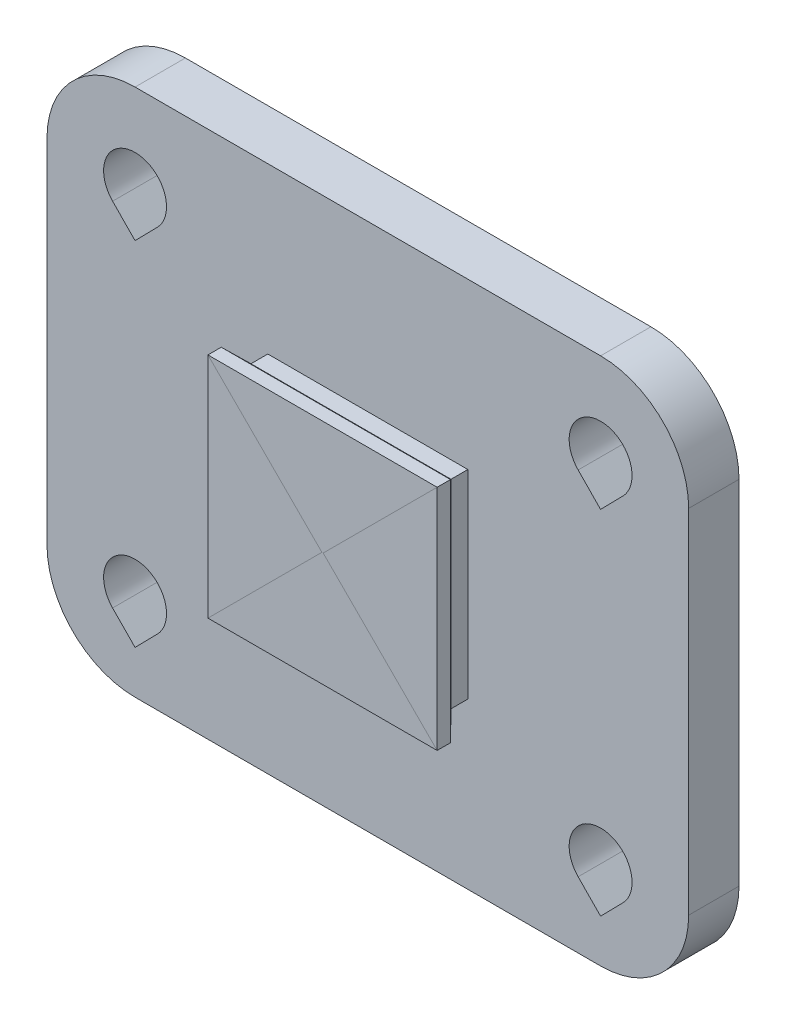
ISO-10303-21;
HEADER;
FILE_DESCRIPTION(('STEP AP214'),'2;1');
FILE_NAME('part.step','',(''),(''),'','','');
FILE_SCHEMA(('AUTOMOTIVE_DESIGN { 1 0 10303 214 1 1 1 1 }'));
ENDSEC;
DATA;
#1=APPLICATION_CONTEXT('core data for automotive mechanical design processes');
#2=APPLICATION_PROTOCOL_DEFINITION('international standard','automotive_design',2000,#1);
#3=PRODUCT_CONTEXT('',#1,'mechanical');
#4=PRODUCT('Part','Part','',(#3));
#5=PRODUCT_RELATED_PRODUCT_CATEGORY('part','',(#4));
#6=PRODUCT_DEFINITION_FORMATION('','',#4);
#7=PRODUCT_DEFINITION_CONTEXT('part definition',#1,'design');
#8=PRODUCT_DEFINITION('design','',#6,#7);
#9=PRODUCT_DEFINITION_SHAPE('','',#8);
#10=(LENGTH_UNIT() NAMED_UNIT(*) SI_UNIT(.MILLI.,.METRE.));
#11=(NAMED_UNIT(*) PLANE_ANGLE_UNIT() SI_UNIT($,.RADIAN.));
#12=(NAMED_UNIT(*) SI_UNIT($,.STERADIAN.) SOLID_ANGLE_UNIT());
#13=UNCERTAINTY_MEASURE_WITH_UNIT(LENGTH_MEASURE(1.E-05),#10,'distance_accuracy_value','');
#14=(GEOMETRIC_REPRESENTATION_CONTEXT(3) GLOBAL_UNCERTAINTY_ASSIGNED_CONTEXT((#13)) GLOBAL_UNIT_ASSIGNED_CONTEXT((#10,
#11,#12)) REPRESENTATION_CONTEXT('',''));
#15=CARTESIAN_POINT('',(0.,0.,0.));
#16=DIRECTION('',(0.,0.,1.));
#17=DIRECTION('',(1.,0.,0.));
#18=AXIS2_PLACEMENT_3D('',#15,#16,#17);
#19=CARTESIAN_POINT('',(18.5,10.4268529516415,8.0110740476336));
#20=DIRECTION('',(0.714472679632805,-0.699663340513364,0.));
#21=DIRECTION('',(0.,0.,-1.));
#22=AXIS2_PLACEMENT_3D('',#19,#20,#21);
#23=PLANE('',#22);
#24=DIRECTION('',(0.,0.,-1.));
#25=VECTOR('',#24,1.);
#26=CARTESIAN_POINT('',(18.5,10.4268529516415,4.));
#27=LINE('',#26,#25);
#28=CARTESIAN_POINT('',(18.5,10.4268529516415,4.));
#29=VERTEX_POINT('',#28);
#30=CARTESIAN_POINT('',(18.5,10.4268529516415,0.));
#31=VERTEX_POINT('',#30);
#32=EDGE_CURVE('E11',#29,#31,#27,.T.);
#33=ORIENTED_EDGE('',*,*,#32,.F.);
#34=DIRECTION('',(0.699663340513364,0.714472679632805,0.));
#35=VECTOR('',#34,1.);
#36=CARTESIAN_POINT('',(18.5,10.4268529516415,4.));
#37=LINE('',#36,#35);
#38=CARTESIAN_POINT('',(20.286181699082,12.2508416487166,4.));
#39=VERTEX_POINT('',#38);
#40=EDGE_CURVE('E364',#29,#39,#37,.T.);
#41=ORIENTED_EDGE('',*,*,#40,.T.);
#42=DIRECTION('',(0.,0.,-1.));
#43=VECTOR('',#42,1.);
#44=CARTESIAN_POINT('',(20.286181699082,12.2508416487166,4.));
#45=LINE('',#44,#43);
#46=CARTESIAN_POINT('',(20.286181699082,12.2508416487166,0.));
#47=VERTEX_POINT('',#46);
#48=EDGE_CURVE('E522',#39,#47,#45,.T.);
#49=ORIENTED_EDGE('',*,*,#48,.T.);
#50=DIRECTION('',(0.699663340513364,0.714472679632805,0.));
#51=VECTOR('',#50,1.);
#52=CARTESIAN_POINT('',(18.5,10.4268529516415,0.));
#53=LINE('',#52,#51);
#54=EDGE_CURVE('E439',#31,#47,#53,.T.);
#55=ORIENTED_EDGE('',*,*,#54,.F.);
#56=EDGE_LOOP('',(#33,#41,#49,#55));
#57=FACE_BOUND('',#56,.T.);
#58=ADVANCED_FACE('F17',(#57),#23,.F.);
#59=CARTESIAN_POINT('',(16.713818300918,12.2508416487166,8.0110740476336));
#60=DIRECTION('',(-0.714472679632804,-0.699663340513365,0.));
#61=DIRECTION('',(-0.699663340513365,0.714472679632804,0.));
#62=AXIS2_PLACEMENT_3D('',#59,#60,#61);
#63=PLANE('',#62);
#64=DIRECTION('',(0.,0.,-1.));
#65=VECTOR('',#64,1.);
#66=CARTESIAN_POINT('',(16.713818300918,12.2508416487166,4.));
#67=LINE('',#66,#65);
#68=CARTESIAN_POINT('',(16.713818300918,12.2508416487166,4.));
#69=VERTEX_POINT('',#68);
#70=CARTESIAN_POINT('',(16.713818300918,12.2508416487166,0.));
#71=VERTEX_POINT('',#70);
#72=EDGE_CURVE('E501',#69,#71,#67,.T.);
#73=ORIENTED_EDGE('',*,*,#72,.F.);
#74=DIRECTION('',(0.699663340513365,-0.714472679632804,0.));
#75=VECTOR('',#74,1.);
#76=CARTESIAN_POINT('',(16.713818300918,12.2508416487166,4.));
#77=LINE('',#76,#75);
#78=EDGE_CURVE('E352',#69,#29,#77,.T.);
#79=ORIENTED_EDGE('',*,*,#78,.T.);
#80=ORIENTED_EDGE('',*,*,#32,.T.);
#81=DIRECTION('',(0.699663340513365,-0.714472679632804,0.));
#82=VECTOR('',#81,1.);
#83=CARTESIAN_POINT('',(16.713818300918,12.2508416487166,0.));
#84=LINE('',#83,#82);
#85=EDGE_CURVE('E444',#71,#31,#84,.T.);
#86=ORIENTED_EDGE('',*,*,#85,.F.);
#87=EDGE_LOOP('',(#73,#79,#80,#86));
#88=FACE_BOUND('',#87,.T.);
#89=ADVANCED_FACE('F1187',(#88),#63,.F.);
#90=CARTESIAN_POINT('',(18.5,-17.5731470483585,8.0110740476336));
#91=DIRECTION('',(0.714472679632806,-0.699663340513363,0.));
#92=DIRECTION('',(0.,0.,-1.));
#93=AXIS2_PLACEMENT_3D('',#90,#91,#92);
#94=PLANE('',#93);
#95=DIRECTION('',(0.,0.,-1.));
#96=VECTOR('',#95,1.);
#97=CARTESIAN_POINT('',(18.5,-17.5731470483585,4.));
#98=LINE('',#97,#96);
#99=CARTESIAN_POINT('',(18.5,-17.5731470483585,4.));
#100=VERTEX_POINT('',#99);
#101=CARTESIAN_POINT('',(18.5,-17.5731470483585,0.));
#102=VERTEX_POINT('',#101);
#103=EDGE_CURVE('E20',#100,#102,#98,.T.);
#104=ORIENTED_EDGE('',*,*,#103,.F.);
#105=DIRECTION('',(0.699663340513363,0.714472679632805,0.));
#106=VECTOR('',#105,1.);
#107=CARTESIAN_POINT('',(18.5,-17.5731470483585,4.));
#108=LINE('',#107,#106);
#109=CARTESIAN_POINT('',(20.286181699082,-15.7491583512834,4.));
#110=VERTEX_POINT('',#109);
#111=EDGE_CURVE('E344',#100,#110,#108,.T.);
#112=ORIENTED_EDGE('',*,*,#111,.T.);
#113=DIRECTION('',(0.,0.,-1.));
#114=VECTOR('',#113,1.);
#115=CARTESIAN_POINT('',(20.286181699082,-15.7491583512834,4.));
#116=LINE('',#115,#114);
#117=CARTESIAN_POINT('',(20.286181699082,-15.7491583512834,0.));
#118=VERTEX_POINT('',#117);
#119=EDGE_CURVE('E486',#110,#118,#116,.T.);
#120=ORIENTED_EDGE('',*,*,#119,.T.);
#121=DIRECTION('',(0.699663340513363,0.714472679632805,0.));
#122=VECTOR('',#121,1.);
#123=CARTESIAN_POINT('',(18.5,-17.5731470483585,0.));
#124=LINE('',#123,#122);
#125=EDGE_CURVE('E323',#102,#118,#124,.T.);
#126=ORIENTED_EDGE('',*,*,#125,.F.);
#127=EDGE_LOOP('',(#104,#112,#120,#126));
#128=FACE_BOUND('',#127,.T.);
#129=ADVANCED_FACE('F1182',(#128),#94,.F.);
#130=CARTESIAN_POINT('',(16.713818300918,-15.7491583512834,8.0110740476336));
#131=DIRECTION('',(-0.714472679632805,-0.699663340513364,0.));
#132=DIRECTION('',(-0.699663340513364,0.714472679632805,0.));
#133=AXIS2_PLACEMENT_3D('',#130,#131,#132);
#134=PLANE('',#133);
#135=DIRECTION('',(0.,0.,-1.));
#136=VECTOR('',#135,1.);
#137=CARTESIAN_POINT('',(16.713818300918,-15.7491583512834,4.));
#138=LINE('',#137,#136);
#139=CARTESIAN_POINT('',(16.713818300918,-15.7491583512834,4.));
#140=VERTEX_POINT('',#139);
#141=CARTESIAN_POINT('',(16.713818300918,-15.7491583512834,0.));
#142=VERTEX_POINT('',#141);
#143=EDGE_CURVE('E483',#140,#142,#138,.T.);
#144=ORIENTED_EDGE('',*,*,#143,.F.);
#145=DIRECTION('',(0.699663340513364,-0.714472679632805,0.));
#146=VECTOR('',#145,1.);
#147=CARTESIAN_POINT('',(16.713818300918,-15.7491583512834,4.));
#148=LINE('',#147,#146);
#149=EDGE_CURVE('E297',#140,#100,#148,.T.);
#150=ORIENTED_EDGE('',*,*,#149,.T.);
#151=ORIENTED_EDGE('',*,*,#103,.T.);
#152=DIRECTION('',(0.699663340513364,-0.714472679632805,0.));
#153=VECTOR('',#152,1.);
#154=CARTESIAN_POINT('',(16.713818300918,-15.7491583512834,0.));
#155=LINE('',#154,#153);
#156=EDGE_CURVE('E322',#142,#102,#155,.T.);
#157=ORIENTED_EDGE('',*,*,#156,.F.);
#158=EDGE_LOOP('',(#144,#150,#151,#157));
#159=FACE_BOUND('',#158,.T.);
#160=ADVANCED_FACE('F1040',(#159),#134,.F.);
#161=CARTESIAN_POINT('',(18.5,-14.,4.));
#162=DIRECTION('',(0.,0.,-1.));
#163=DIRECTION('',(0.,1.,0.));
#164=AXIS2_PLACEMENT_3D('',#161,#162,#163);
#165=CYLINDRICAL_SURFACE('',#164,2.5);
#166=ORIENTED_EDGE('',*,*,#143,.T.);
#167=CARTESIAN_POINT('',(18.5,-14.,0.));
#168=DIRECTION('',(0.,0.,1.));
#169=DIRECTION('',(-1.,0.,0.));
#170=AXIS2_PLACEMENT_3D('',#167,#168,#169);
#171=CIRCLE('',#170,2.5);
#172=EDGE_CURVE('E318',#118,#142,#171,.T.);
#173=ORIENTED_EDGE('',*,*,#172,.F.);
#174=ORIENTED_EDGE('',*,*,#119,.F.);
#175=CARTESIAN_POINT('',(18.5,-14.,4.));
#176=DIRECTION('',(0.,0.,1.));
#177=DIRECTION('',(-1.,0.,0.));
#178=AXIS2_PLACEMENT_3D('',#175,#176,#177);
#179=CIRCLE('',#178,2.5);
#180=EDGE_CURVE('E340',#110,#140,#179,.T.);
#181=ORIENTED_EDGE('',*,*,#180,.T.);
#182=EDGE_LOOP('',(#166,#173,#174,#181));
#183=FACE_BOUND('',#182,.T.);
#184=ADVANCED_FACE('F1034',(#183),#165,.F.);
#185=CARTESIAN_POINT('',(18.5,-14.,4.));
#186=DIRECTION('',(0.,0.,-1.));
#187=DIRECTION('',(1.,0.,0.));
#188=AXIS2_PLACEMENT_3D('',#185,#186,#187);
#189=CYLINDRICAL_SURFACE('',#188,7.);
#190=CARTESIAN_POINT('',(18.5,-14.,0.));
#191=DIRECTION('',(0.,0.,1.));
#192=DIRECTION('',(-1.,0.,0.));
#193=AXIS2_PLACEMENT_3D('',#190,#191,#192);
#194=CIRCLE('',#193,7.);
#195=CARTESIAN_POINT('',(18.5,-21.,0.));
#196=VERTEX_POINT('',#195);
#197=CARTESIAN_POINT('',(25.5,-14.,0.));
#198=VERTEX_POINT('',#197);
#199=EDGE_CURVE('E374',#196,#198,#194,.T.);
#200=ORIENTED_EDGE('',*,*,#199,.T.);
#201=DIRECTION('',(0.,0.,-1.));
#202=VECTOR('',#201,1.);
#203=CARTESIAN_POINT('',(25.5,-14.,4.));
#204=LINE('',#203,#202);
#205=CARTESIAN_POINT('',(25.5,-14.,4.));
#206=VERTEX_POINT('',#205);
#207=EDGE_CURVE('E498',#206,#198,#204,.T.);
#208=ORIENTED_EDGE('',*,*,#207,.F.);
#209=CARTESIAN_POINT('',(18.5,-14.,4.));
#210=DIRECTION('',(0.,0.,1.));
#211=DIRECTION('',(-1.,0.,0.));
#212=AXIS2_PLACEMENT_3D('',#209,#210,#211);
#213=CIRCLE('',#212,7.);
#214=CARTESIAN_POINT('',(18.5,-21.,4.));
#215=VERTEX_POINT('',#214);
#216=EDGE_CURVE('E836',#215,#206,#213,.T.);
#217=ORIENTED_EDGE('',*,*,#216,.F.);
#218=DIRECTION('',(0.,0.,-1.));
#219=VECTOR('',#218,1.);
#220=CARTESIAN_POINT('',(18.5,-21.,4.));
#221=LINE('',#220,#219);
#222=EDGE_CURVE('E482',#215,#196,#221,.T.);
#223=ORIENTED_EDGE('',*,*,#222,.T.);
#224=EDGE_LOOP('',(#200,#208,#217,#223));
#225=FACE_BOUND('',#224,.T.);
#226=ADVANCED_FACE('F1039',(#225),#189,.T.);
#227=CARTESIAN_POINT('',(7.95,9.27470918274534,5.34040262258352));
#228=DIRECTION('',(-0.71933980033865,0.,0.694658370458998));
#229=DIRECTION('',(0.,1.,0.));
#230=AXIS2_PLACEMENT_3D('',#227,#228,#229);
#231=PLANE('',#230);
#232=DIRECTION('',(-0.570514335805199,-0.570514335805199,-0.590784889178375));
#233=VECTOR('',#232,1.);
#234=CARTESIAN_POINT('',(9.10882652976849,9.05882652976849,6.54040262258352));
#235=LINE('',#234,#233);
#236=CARTESIAN_POINT('',(9.10882652976849,9.05882652976849,6.54040262258352));
#237=VERTEX_POINT('',#236);
#238=CARTESIAN_POINT('',(7.95,7.9,5.34040262258352));
#239=VERTEX_POINT('',#238);
#240=EDGE_CURVE('E477',#237,#239,#235,.T.);
#241=ORIENTED_EDGE('',*,*,#240,.F.);
#242=DIRECTION('',(0.,-1.,0.));
#243=VECTOR('',#242,1.);
#244=CARTESIAN_POINT('',(9.10882652976849,9.05882652976849,6.54040262258352));
#245=LINE('',#244,#243);
#246=CARTESIAN_POINT('',(9.10882652976849,-9.05882652976849,6.54040262258352));
#247=VERTEX_POINT('',#246);
#248=EDGE_CURVE('E38',#237,#247,#245,.T.);
#249=ORIENTED_EDGE('',*,*,#248,.T.);
#250=DIRECTION('',(-0.570514335805199,0.570514335805199,-0.590784889178375));
#251=VECTOR('',#250,1.);
#252=CARTESIAN_POINT('',(9.10882652976849,-9.05882652976849,6.54040262258352));
#253=LINE('',#252,#251);
#254=CARTESIAN_POINT('',(7.95,-7.9,5.34040262258352));
#255=VERTEX_POINT('',#254);
#256=EDGE_CURVE('E509',#247,#255,#253,.T.);
#257=ORIENTED_EDGE('',*,*,#256,.T.);
#258=DIRECTION('',(0.,-1.,0.));
#259=VECTOR('',#258,1.);
#260=CARTESIAN_POINT('',(7.95,7.9,5.34040262258352));
#261=LINE('',#260,#259);
#262=EDGE_CURVE('E48',#239,#255,#261,.T.);
#263=ORIENTED_EDGE('',*,*,#262,.F.);
#264=EDGE_LOOP('',(#241,#249,#257,#263));
#265=FACE_BOUND('',#264,.T.);
#266=ADVANCED_FACE('F1163',(#265),#231,.F.);
#267=CARTESIAN_POINT('',(9.10882652976849,9.27470918274534,6.54040262258352));
#268=DIRECTION('',(-1.,0.,0.));
#269=DIRECTION('',(0.,0.,1.));
#270=AXIS2_PLACEMENT_3D('',#267,#268,#269);
#271=PLANE('',#270);
#272=DIRECTION('',(0.,0.,-1.));
#273=VECTOR('',#272,1.);
#274=CARTESIAN_POINT('',(9.10882652976849,9.05882652976849,7.6));
#275=LINE('',#274,#273);
#276=CARTESIAN_POINT('',(9.10882652976849,9.05882652976849,7.6));
#277=VERTEX_POINT('',#276);
#278=EDGE_CURVE('E478',#277,#237,#275,.T.);
#279=ORIENTED_EDGE('',*,*,#278,.F.);
#280=DIRECTION('',(0.,-1.,0.));
#281=VECTOR('',#280,1.);
#282=CARTESIAN_POINT('',(9.10882652976849,9.05882652976849,7.6));
#283=LINE('',#282,#281);
#284=CARTESIAN_POINT('',(9.10882652976849,-9.05882652976849,7.6));
#285=VERTEX_POINT('',#284);
#286=EDGE_CURVE('E433',#277,#285,#283,.T.);
#287=ORIENTED_EDGE('',*,*,#286,.T.);
#288=DIRECTION('',(0.,0.,-1.));
#289=VECTOR('',#288,1.);
#290=CARTESIAN_POINT('',(9.10882652976849,-9.05882652976849,7.6));
#291=LINE('',#290,#289);
#292=EDGE_CURVE('E505',#285,#247,#291,.T.);
#293=ORIENTED_EDGE('',*,*,#292,.T.);
#294=ORIENTED_EDGE('',*,*,#248,.F.);
#295=EDGE_LOOP('',(#279,#287,#293,#294));
#296=FACE_BOUND('',#295,.T.);
#297=ADVANCED_FACE('F1154',(#296),#271,.F.);
#298=CARTESIAN_POINT('',(9.10882652976849,9.27470918274534,7.6));
#299=DIRECTION('',(0.,0.,-1.));
#300=DIRECTION('',(0.,-1.,0.));
#301=AXIS2_PLACEMENT_3D('',#298,#299,#300);
#302=PLANE('',#301);
#303=DIRECTION('',(0.707106781186548,0.707106781186547,0.));
#304=VECTOR('',#303,1.);
#305=CARTESIAN_POINT('',(0.0499999999999954,0.,7.6));
#306=LINE('',#305,#304);
#307=CARTESIAN_POINT('',(0.0499999999999952,0.,7.6));
#308=VERTEX_POINT('',#307);
#309=EDGE_CURVE('E613',#308,#277,#306,.T.);
#310=ORIENTED_EDGE('',*,*,#309,.F.);
#311=DIRECTION('',(0.707106781186547,-0.707106781186548,0.));
#312=VECTOR('',#311,1.);
#313=CARTESIAN_POINT('',(0.0499999999999988,0.,7.6));
#314=LINE('',#313,#312);
#315=EDGE_CURVE('E456',#308,#285,#314,.T.);
#316=ORIENTED_EDGE('',*,*,#315,.T.);
#317=ORIENTED_EDGE('',*,*,#286,.F.);
#318=EDGE_LOOP('',(#310,#316,#317));
#319=FACE_BOUND('',#318,.T.);
#320=ADVANCED_FACE('F1146',(#319),#302,.F.);
#321=CARTESIAN_POINT('',(7.95,9.27470918274534,4.));
#322=DIRECTION('',(-1.,0.,0.));
#323=DIRECTION('',(0.,0.,1.));
#324=AXIS2_PLACEMENT_3D('',#321,#322,#323);
#325=PLANE('',#324);
#326=DIRECTION('',(0.,0.,-1.));
#327=VECTOR('',#326,1.);
#328=CARTESIAN_POINT('',(7.95,7.9,5.34040262258352));
#329=LINE('',#328,#327);
#330=CARTESIAN_POINT('',(7.95,7.9,4.));
#331=VERTEX_POINT('',#330);
#332=EDGE_CURVE('E457',#239,#331,#329,.T.);
#333=ORIENTED_EDGE('',*,*,#332,.F.);
#334=ORIENTED_EDGE('',*,*,#262,.T.);
#335=DIRECTION('',(0.,0.,-1.));
#336=VECTOR('',#335,1.);
#337=CARTESIAN_POINT('',(7.95,-7.9,5.34040262258352));
#338=LINE('',#337,#336);
#339=CARTESIAN_POINT('',(7.95,-7.9,4.));
#340=VERTEX_POINT('',#339);
#341=EDGE_CURVE('E494',#255,#340,#338,.T.);
#342=ORIENTED_EDGE('',*,*,#341,.T.);
#343=DIRECTION('',(0.,-1.,0.));
#344=VECTOR('',#343,1.);
#345=CARTESIAN_POINT('',(7.95,7.9,4.));
#346=LINE('',#345,#344);
#347=EDGE_CURVE('E295',#331,#340,#346,.T.);
#348=ORIENTED_EDGE('',*,*,#347,.F.);
#349=EDGE_LOOP('',(#333,#334,#342,#348));
#350=FACE_BOUND('',#349,.T.);
#351=ADVANCED_FACE('F968',(#350),#325,.F.);
#352=CARTESIAN_POINT('',(18.5,14.,4.));
#353=DIRECTION('',(0.,0.,-1.));
#354=DIRECTION('',(0.,1.,0.));
#355=AXIS2_PLACEMENT_3D('',#352,#353,#354);
#356=CYLINDRICAL_SURFACE('',#355,2.5);
#357=ORIENTED_EDGE('',*,*,#72,.T.);
#358=CARTESIAN_POINT('',(18.5,14.,0.));
#359=DIRECTION('',(0.,0.,-1.));
#360=DIRECTION('',(-1.,0.,0.));
#361=AXIS2_PLACEMENT_3D('',#358,#359,#360);
#362=CIRCLE('',#361,2.5);
#363=EDGE_CURVE('E443',#71,#47,#362,.T.);
#364=ORIENTED_EDGE('',*,*,#363,.T.);
#365=ORIENTED_EDGE('',*,*,#48,.F.);
#366=CARTESIAN_POINT('',(18.5,14.,4.));
#367=DIRECTION('',(0.,0.,-1.));
#368=DIRECTION('',(-1.,0.,0.));
#369=AXIS2_PLACEMENT_3D('',#366,#367,#368);
#370=CIRCLE('',#369,2.5);
#371=EDGE_CURVE('E356',#69,#39,#370,.T.);
#372=ORIENTED_EDGE('',*,*,#371,.F.);
#373=EDGE_LOOP('',(#357,#364,#365,#372));
#374=FACE_BOUND('',#373,.T.);
#375=ADVANCED_FACE('F962',(#374),#356,.F.);
#376=CARTESIAN_POINT('',(25.5,0.,4.));
#377=DIRECTION('',(-1.,0.,0.));
#378=DIRECTION('',(0.,0.,1.));
#379=AXIS2_PLACEMENT_3D('',#376,#377,#378);
#380=PLANE('',#379);
#381=DIRECTION('',(0.,-1.,0.));
#382=VECTOR('',#381,1.);
#383=CARTESIAN_POINT('',(25.5,14.,0.));
#384=LINE('',#383,#382);
#385=CARTESIAN_POINT('',(25.5,14.,0.));
#386=VERTEX_POINT('',#385);
#387=EDGE_CURVE('E389',#386,#198,#384,.T.);
#388=ORIENTED_EDGE('',*,*,#387,.F.);
#389=DIRECTION('',(0.,0.,-1.));
#390=VECTOR('',#389,1.);
#391=CARTESIAN_POINT('',(25.5,14.,4.));
#392=LINE('',#391,#390);
#393=CARTESIAN_POINT('',(25.5,14.,4.));
#394=VERTEX_POINT('',#393);
#395=EDGE_CURVE('E502',#394,#386,#392,.T.);
#396=ORIENTED_EDGE('',*,*,#395,.F.);
#397=DIRECTION('',(0.,-1.,0.));
#398=VECTOR('',#397,1.);
#399=CARTESIAN_POINT('',(25.5,14.,4.));
#400=LINE('',#399,#398);
#401=EDGE_CURVE('E830',#394,#206,#400,.T.);
#402=ORIENTED_EDGE('',*,*,#401,.T.);
#403=ORIENTED_EDGE('',*,*,#207,.T.);
#404=EDGE_LOOP('',(#388,#396,#402,#403));
#405=FACE_BOUND('',#404,.T.);
#406=ADVANCED_FACE('F967',(#405),#380,.F.);
#407=CARTESIAN_POINT('',(18.5,14.,4.));
#408=DIRECTION('',(0.,0.,-1.));
#409=DIRECTION('',(1.,0.,0.));
#410=AXIS2_PLACEMENT_3D('',#407,#408,#409);
#411=CYLINDRICAL_SURFACE('',#410,7.);
#412=CARTESIAN_POINT('',(18.5,14.,0.));
#413=DIRECTION('',(0.,0.,-1.));
#414=DIRECTION('',(-1.,0.,0.));
#415=AXIS2_PLACEMENT_3D('',#412,#413,#414);
#416=CIRCLE('',#415,7.);
#417=CARTESIAN_POINT('',(18.5,21.,0.));
#418=VERTEX_POINT('',#417);
#419=EDGE_CURVE('E382',#418,#386,#416,.T.);
#420=ORIENTED_EDGE('',*,*,#419,.F.);
#421=DIRECTION('',(0.,0.,-1.));
#422=VECTOR('',#421,1.);
#423=CARTESIAN_POINT('',(18.5,21.,4.));
#424=LINE('',#423,#422);
#425=CARTESIAN_POINT('',(18.5,21.,4.));
#426=VERTEX_POINT('',#425);
#427=EDGE_CURVE('E368',#426,#418,#424,.T.);
#428=ORIENTED_EDGE('',*,*,#427,.F.);
#429=CARTESIAN_POINT('',(18.5,14.,4.));
#430=DIRECTION('',(0.,0.,-1.));
#431=DIRECTION('',(-1.,0.,0.));
#432=AXIS2_PLACEMENT_3D('',#429,#430,#431);
#433=CIRCLE('',#432,7.);
#434=EDGE_CURVE('E872',#426,#394,#433,.T.);
#435=ORIENTED_EDGE('',*,*,#434,.T.);
#436=ORIENTED_EDGE('',*,*,#395,.T.);
#437=EDGE_LOOP('',(#420,#428,#435,#436));
#438=FACE_BOUND('',#437,.T.);
#439=ADVANCED_FACE('F996',(#438),#411,.T.);
#440=CARTESIAN_POINT('',(-18.5,10.4268529516415,8.0110740476336));
#441=DIRECTION('',(-0.714472679632805,-0.699663340513364,0.));
#442=DIRECTION('',(-0.699663340513364,0.714472679632805,0.));
#443=AXIS2_PLACEMENT_3D('',#440,#441,#442);
#444=PLANE('',#443);
#445=DIRECTION('',(0.,0.,-1.));
#446=VECTOR('',#445,1.);
#447=CARTESIAN_POINT('',(-18.5,10.4268529516415,4.));
#448=LINE('',#447,#446);
#449=CARTESIAN_POINT('',(-18.5,10.4268529516415,4.));
#450=VERTEX_POINT('',#449);
#451=CARTESIAN_POINT('',(-18.5,10.4268529516415,0.));
#452=VERTEX_POINT('',#451);
#453=EDGE_CURVE('E515',#450,#452,#448,.T.);
#454=ORIENTED_EDGE('',*,*,#453,.T.);
#455=DIRECTION('',(-0.699663340513364,0.714472679632805,0.));
#456=VECTOR('',#455,1.);
#457=CARTESIAN_POINT('',(-18.5,10.4268529516415,0.));
#458=LINE('',#457,#456);
#459=CARTESIAN_POINT('',(-20.286181699082,12.2508416487166,0.));
#460=VERTEX_POINT('',#459);
#461=EDGE_CURVE('E328',#452,#460,#458,.T.);
#462=ORIENTED_EDGE('',*,*,#461,.T.);
#463=DIRECTION('',(0.,0.,-1.));
#464=VECTOR('',#463,1.);
#465=CARTESIAN_POINT('',(-20.286181699082,12.2508416487166,4.));
#466=LINE('',#465,#464);
#467=CARTESIAN_POINT('',(-20.286181699082,12.2508416487166,4.));
#468=VERTEX_POINT('',#467);
#469=EDGE_CURVE('E357',#468,#460,#466,.T.);
#470=ORIENTED_EDGE('',*,*,#469,.F.);
#471=DIRECTION('',(-0.699663340513364,0.714472679632805,0.));
#472=VECTOR('',#471,1.);
#473=CARTESIAN_POINT('',(-18.5,10.4268529516415,4.));
#474=LINE('',#473,#472);
#475=EDGE_CURVE('E313',#450,#468,#474,.T.);
#476=ORIENTED_EDGE('',*,*,#475,.F.);
#477=EDGE_LOOP('',(#454,#462,#470,#476));
#478=FACE_BOUND('',#477,.T.);
#479=ADVANCED_FACE('F1123',(#478),#444,.F.);
#480=CARTESIAN_POINT('',(-16.713818300918,12.2508416487166,8.0110740476336));
#481=DIRECTION('',(0.714472679632804,-0.699663340513365,0.));
#482=DIRECTION('',(0.,0.,-1.));
#483=AXIS2_PLACEMENT_3D('',#480,#481,#482);
#484=PLANE('',#483);
#485=DIRECTION('',(0.,0.,-1.));
#486=VECTOR('',#485,1.);
#487=CARTESIAN_POINT('',(-16.713818300918,12.2508416487166,4.));
#488=LINE('',#487,#486);
#489=CARTESIAN_POINT('',(-16.713818300918,12.2508416487166,4.));
#490=VERTEX_POINT('',#489);
#491=CARTESIAN_POINT('',(-16.713818300918,12.2508416487166,0.));
#492=VERTEX_POINT('',#491);
#493=EDGE_CURVE('E360',#490,#492,#488,.T.);
#494=ORIENTED_EDGE('',*,*,#493,.T.);
#495=DIRECTION('',(-0.699663340513365,-0.714472679632804,0.));
#496=VECTOR('',#495,1.);
#497=CARTESIAN_POINT('',(-16.713818300918,12.2508416487166,0.));
#498=LINE('',#497,#496);
#499=EDGE_CURVE('E406',#492,#452,#498,.T.);
#500=ORIENTED_EDGE('',*,*,#499,.T.);
#501=ORIENTED_EDGE('',*,*,#453,.F.);
#502=DIRECTION('',(-0.699663340513365,-0.714472679632804,0.));
#503=VECTOR('',#502,1.);
#504=CARTESIAN_POINT('',(-16.713818300918,12.2508416487166,4.));
#505=LINE('',#504,#503);
#506=EDGE_CURVE('E804',#490,#450,#505,.T.);
#507=ORIENTED_EDGE('',*,*,#506,.F.);
#508=EDGE_LOOP('',(#494,#500,#501,#507));
#509=FACE_BOUND('',#508,.T.);
#510=ADVANCED_FACE('F1114',(#509),#484,.F.);
#511=CARTESIAN_POINT('',(-18.5,-17.5731470483585,8.0110740476336));
#512=DIRECTION('',(-0.714472679632806,-0.699663340513363,0.));
#513=DIRECTION('',(-0.699663340513363,0.714472679632806,0.));
#514=AXIS2_PLACEMENT_3D('',#511,#512,#513);
#515=PLANE('',#514);
#516=DIRECTION('',(0.,0.,-1.));
#517=VECTOR('',#516,1.);
#518=CARTESIAN_POINT('',(-18.5,-17.5731470483585,4.));
#519=LINE('',#518,#517);
#520=CARTESIAN_POINT('',(-18.5,-17.5731470483585,4.));
#521=VERTEX_POINT('',#520);
#522=CARTESIAN_POINT('',(-18.5,-17.5731470483585,0.));
#523=VERTEX_POINT('',#522);
#524=EDGE_CURVE('E512',#521,#523,#519,.T.);
#525=ORIENTED_EDGE('',*,*,#524,.T.);
#526=DIRECTION('',(-0.699663340513363,0.714472679632805,0.));
#527=VECTOR('',#526,1.);
#528=CARTESIAN_POINT('',(-18.5,-17.5731470483585,0.));
#529=LINE('',#528,#527);
#530=CARTESIAN_POINT('',(-20.286181699082,-15.7491583512834,0.));
#531=VERTEX_POINT('',#530);
#532=EDGE_CURVE('E414',#523,#531,#529,.T.);
#533=ORIENTED_EDGE('',*,*,#532,.T.);
#534=DIRECTION('',(0.,0.,-1.));
#535=VECTOR('',#534,1.);
#536=CARTESIAN_POINT('',(-20.286181699082,-15.7491583512834,4.));
#537=LINE('',#536,#535);
#538=CARTESIAN_POINT('',(-20.286181699082,-15.7491583512834,4.));
#539=VERTEX_POINT('',#538);
#540=EDGE_CURVE('E345',#539,#531,#537,.T.);
#541=ORIENTED_EDGE('',*,*,#540,.F.);
#542=DIRECTION('',(-0.699663340513363,0.714472679632805,0.));
#543=VECTOR('',#542,1.);
#544=CARTESIAN_POINT('',(-18.5,-17.5731470483585,4.));
#545=LINE('',#544,#543);
#546=EDGE_CURVE('E818',#521,#539,#545,.T.);
#547=ORIENTED_EDGE('',*,*,#546,.F.);
#548=EDGE_LOOP('',(#525,#533,#541,#547));
#549=FACE_BOUND('',#548,.T.);
#550=ADVANCED_FACE('F1105',(#549),#515,.F.);
#551=CARTESIAN_POINT('',(-16.713818300918,-15.7491583512834,8.0110740476336));
#552=DIRECTION('',(0.714472679632805,-0.699663340513364,0.));
#553=DIRECTION('',(0.,0.,-1.));
#554=AXIS2_PLACEMENT_3D('',#551,#552,#553);
#555=PLANE('',#554);
#556=DIRECTION('',(0.,0.,-1.));
#557=VECTOR('',#556,1.);
#558=CARTESIAN_POINT('',(-16.713818300918,-15.7491583512834,4.));
#559=LINE('',#558,#557);
#560=CARTESIAN_POINT('',(-16.713818300918,-15.7491583512834,4.));
#561=VERTEX_POINT('',#560);
#562=CARTESIAN_POINT('',(-16.713818300918,-15.7491583512834,0.));
#563=VERTEX_POINT('',#562);
#564=EDGE_CURVE('E348',#561,#563,#559,.T.);
#565=ORIENTED_EDGE('',*,*,#564,.T.);
#566=DIRECTION('',(-0.699663340513364,-0.714472679632805,0.));
#567=VECTOR('',#566,1.);
#568=CARTESIAN_POINT('',(-16.713818300918,-15.7491583512834,0.));
#569=LINE('',#568,#567);
#570=EDGE_CURVE('E428',#563,#523,#569,.T.);
#571=ORIENTED_EDGE('',*,*,#570,.T.);
#572=ORIENTED_EDGE('',*,*,#524,.F.);
#573=DIRECTION('',(-0.699663340513364,-0.714472679632805,0.));
#574=VECTOR('',#573,1.);
#575=CARTESIAN_POINT('',(-16.713818300918,-15.7491583512834,4.));
#576=LINE('',#575,#574);
#577=EDGE_CURVE('E824',#561,#521,#576,.T.);
#578=ORIENTED_EDGE('',*,*,#577,.F.);
#579=EDGE_LOOP('',(#565,#571,#572,#578));
#580=FACE_BOUND('',#579,.T.);
#581=ADVANCED_FACE('F1074',(#580),#555,.F.);
#582=CARTESIAN_POINT('',(0.,-7.9,5.34040262258352));
#583=DIRECTION('',(0.,0.71933980033865,0.694658370458998));
#584=DIRECTION('',(1.,0.,0.));
#585=AXIS2_PLACEMENT_3D('',#582,#583,#584);
#586=PLANE('',#585);
#587=DIRECTION('',(-1.,0.,0.));
#588=VECTOR('',#587,1.);
#589=CARTESIAN_POINT('',(9.10882652976849,-9.0588265297685,6.54040262258352));
#590=LINE('',#589,#588);
#591=CARTESIAN_POINT('',(-9.10882652976849,-9.05882652976849,6.54040262258352));
#592=VERTEX_POINT('',#591);
#593=EDGE_CURVE('E497',#247,#592,#590,.T.);
#594=ORIENTED_EDGE('',*,*,#593,.T.);
#595=DIRECTION('',(0.570514335805199,0.570514335805199,-0.590784889178375));
#596=VECTOR('',#595,1.);
#597=CARTESIAN_POINT('',(-9.10882652976849,-9.05882652976849,6.54040262258352));
#598=LINE('',#597,#596);
#599=CARTESIAN_POINT('',(-7.95,-7.9,5.34040262258352));
#600=VERTEX_POINT('',#599);
#601=EDGE_CURVE('E332',#592,#600,#598,.T.);
#602=ORIENTED_EDGE('',*,*,#601,.T.);
#603=DIRECTION('',(-1.,0.,0.));
#604=VECTOR('',#603,1.);
#605=CARTESIAN_POINT('',(7.95,-7.9,5.34040262258352));
#606=LINE('',#605,#604);
#607=EDGE_CURVE('E279',#255,#600,#606,.T.);
#608=ORIENTED_EDGE('',*,*,#607,.F.);
#609=ORIENTED_EDGE('',*,*,#256,.F.);
#610=EDGE_LOOP('',(#594,#602,#608,#609));
#611=FACE_BOUND('',#610,.T.);
#612=ADVANCED_FACE('F1068',(#611),#586,.F.);
#613=CARTESIAN_POINT('',(0.,-9.05882652976849,6.54040262258352));
#614=DIRECTION('',(0.,1.,0.));
#615=DIRECTION('',(1.,0.,0.));
#616=AXIS2_PLACEMENT_3D('',#613,#614,#615);
#617=PLANE('',#616);
#618=DIRECTION('',(-1.,0.,0.));
#619=VECTOR('',#618,1.);
#620=CARTESIAN_POINT('',(9.10882652976849,-9.0588265297685,7.6));
#621=LINE('',#620,#619);
#622=CARTESIAN_POINT('',(-9.10882652976849,-9.05882652976849,7.6));
#623=VERTEX_POINT('',#622);
#624=EDGE_CURVE('E453',#285,#623,#621,.T.);
#625=ORIENTED_EDGE('',*,*,#624,.T.);
#626=DIRECTION('',(0.,0.,-1.));
#627=VECTOR('',#626,1.);
#628=CARTESIAN_POINT('',(-9.10882652976849,-9.05882652976849,7.6));
#629=LINE('',#628,#627);
#630=EDGE_CURVE('E468',#623,#592,#629,.T.);
#631=ORIENTED_EDGE('',*,*,#630,.T.);
#632=ORIENTED_EDGE('',*,*,#593,.F.);
#633=ORIENTED_EDGE('',*,*,#292,.F.);
#634=EDGE_LOOP('',(#625,#631,#632,#633));
#635=FACE_BOUND('',#634,.T.);
#636=ADVANCED_FACE('F1073',(#635),#617,.F.);
#637=CARTESIAN_POINT('',(0.,-7.9,4.));
#638=DIRECTION('',(0.,1.,0.));
#639=DIRECTION('',(1.,0.,0.));
#640=AXIS2_PLACEMENT_3D('',#637,#638,#639);
#641=PLANE('',#640);
#642=ORIENTED_EDGE('',*,*,#607,.T.);
#643=DIRECTION('',(0.,0.,-1.));
#644=VECTOR('',#643,1.);
#645=CARTESIAN_POINT('',(-7.95,-7.9,5.34040262258352));
#646=LINE('',#645,#644);
#647=CARTESIAN_POINT('',(-7.95,-7.9,4.));
#648=VERTEX_POINT('',#647);
#649=EDGE_CURVE('E272',#600,#648,#646,.T.);
#650=ORIENTED_EDGE('',*,*,#649,.T.);
#651=DIRECTION('',(-1.,0.,0.));
#652=VECTOR('',#651,1.);
#653=CARTESIAN_POINT('',(7.95,-7.9,4.));
#654=LINE('',#653,#652);
#655=EDGE_CURVE('E276',#340,#648,#654,.T.);
#656=ORIENTED_EDGE('',*,*,#655,.F.);
#657=ORIENTED_EDGE('',*,*,#341,.F.);
#658=EDGE_LOOP('',(#642,#650,#656,#657));
#659=FACE_BOUND('',#658,.T.);
#660=ADVANCED_FACE('F274',(#659),#641,.F.);
#661=CARTESIAN_POINT('',(-18.5,-14.,4.));
#662=DIRECTION('',(0.,0.,-1.));
#663=DIRECTION('',(0.,1.,0.));
#664=AXIS2_PLACEMENT_3D('',#661,#662,#663);
#665=CYLINDRICAL_SURFACE('',#664,2.5);
#666=ORIENTED_EDGE('',*,*,#564,.F.);
#667=CARTESIAN_POINT('',(-18.5,-14.,4.));
#668=DIRECTION('',(0.,0.,-1.));
#669=DIRECTION('',(1.,0.,0.));
#670=AXIS2_PLACEMENT_3D('',#667,#668,#669);
#671=CIRCLE('',#670,2.5);
#672=EDGE_CURVE('E812',#539,#561,#671,.T.);
#673=ORIENTED_EDGE('',*,*,#672,.F.);
#674=ORIENTED_EDGE('',*,*,#540,.T.);
#675=CARTESIAN_POINT('',(-18.5,-14.,0.));
#676=DIRECTION('',(0.,0.,-1.));
#677=DIRECTION('',(1.,0.,0.));
#678=AXIS2_PLACEMENT_3D('',#675,#676,#677);
#679=CIRCLE('',#678,2.5);
#680=EDGE_CURVE('E432',#531,#563,#679,.T.);
#681=ORIENTED_EDGE('',*,*,#680,.T.);
#682=EDGE_LOOP('',(#666,#673,#674,#681));
#683=FACE_BOUND('',#682,.T.);
#684=ADVANCED_FACE('F925',(#683),#665,.F.);
#685=CARTESIAN_POINT('',(-18.5,-14.,4.));
#686=DIRECTION('',(0.,0.,-1.));
#687=DIRECTION('',(-1.,0.,0.));
#688=AXIS2_PLACEMENT_3D('',#685,#686,#687);
#689=CYLINDRICAL_SURFACE('',#688,7.);
#690=CARTESIAN_POINT('',(-18.5,-14.,0.));
#691=DIRECTION('',(0.,0.,-1.));
#692=DIRECTION('',(1.,0.,0.));
#693=AXIS2_PLACEMENT_3D('',#690,#691,#692);
#694=CIRCLE('',#693,7.);
#695=CARTESIAN_POINT('',(-18.5,-21.,0.));
#696=VERTEX_POINT('',#695);
#697=CARTESIAN_POINT('',(-25.5,-14.,0.));
#698=VERTEX_POINT('',#697);
#699=EDGE_CURVE('E373',#696,#698,#694,.T.);
#700=ORIENTED_EDGE('',*,*,#699,.F.);
#701=DIRECTION('',(0.,0.,-1.));
#702=VECTOR('',#701,1.);
#703=CARTESIAN_POINT('',(-18.5,-21.,4.));
#704=LINE('',#703,#702);
#705=CARTESIAN_POINT('',(-18.5,-21.,4.));
#706=VERTEX_POINT('',#705);
#707=EDGE_CURVE('E489',#706,#696,#704,.T.);
#708=ORIENTED_EDGE('',*,*,#707,.F.);
#709=CARTESIAN_POINT('',(-18.5,-14.,4.));
#710=DIRECTION('',(0.,0.,-1.));
#711=DIRECTION('',(1.,0.,0.));
#712=AXIS2_PLACEMENT_3D('',#709,#710,#711);
#713=CIRCLE('',#712,7.);
#714=CARTESIAN_POINT('',(-25.5,-14.,4.));
#715=VERTEX_POINT('',#714);
#716=EDGE_CURVE('E848',#706,#715,#713,.T.);
#717=ORIENTED_EDGE('',*,*,#716,.T.);
#718=DIRECTION('',(0.,0.,-1.));
#719=VECTOR('',#718,1.);
#720=CARTESIAN_POINT('',(-25.5,-14.,4.));
#721=LINE('',#720,#719);
#722=EDGE_CURVE('E393',#715,#698,#721,.T.);
#723=ORIENTED_EDGE('',*,*,#722,.T.);
#724=EDGE_LOOP('',(#700,#708,#717,#723));
#725=FACE_BOUND('',#724,.T.);
#726=ADVANCED_FACE('F915',(#725),#689,.T.);
#727=CARTESIAN_POINT('',(0.,-21.,4.));
#728=DIRECTION('',(0.,1.,0.));
#729=DIRECTION('',(1.,0.,0.));
#730=AXIS2_PLACEMENT_3D('',#727,#728,#729);
#731=PLANE('',#730);
#732=DIRECTION('',(-1.,0.,0.));
#733=VECTOR('',#732,1.);
#734=CARTESIAN_POINT('',(18.5,-21.,0.));
#735=LINE('',#734,#733);
#736=EDGE_CURVE('E369',#196,#696,#735,.T.);
#737=ORIENTED_EDGE('',*,*,#736,.F.);
#738=ORIENTED_EDGE('',*,*,#222,.F.);
#739=DIRECTION('',(-1.,0.,0.));
#740=VECTOR('',#739,1.);
#741=CARTESIAN_POINT('',(18.5,-21.,4.));
#742=LINE('',#741,#740);
#743=EDGE_CURVE('E842',#215,#706,#742,.T.);
#744=ORIENTED_EDGE('',*,*,#743,.T.);
#745=ORIENTED_EDGE('',*,*,#707,.T.);
#746=EDGE_LOOP('',(#737,#738,#744,#745));
#747=FACE_BOUND('',#746,.T.);
#748=ADVANCED_FACE('F909',(#747),#731,.F.);
#749=CARTESIAN_POINT('',(0.,7.9,5.34040262258352));
#750=DIRECTION('',(0.,-0.71933980033865,0.694658370458998));
#751=DIRECTION('',(-1.,0.,0.));
#752=AXIS2_PLACEMENT_3D('',#749,#750,#751);
#753=PLANE('',#752);
#754=DIRECTION('',(-1.,0.,0.));
#755=VECTOR('',#754,1.);
#756=CARTESIAN_POINT('',(9.10882652976849,9.0588265297685,6.54040262258352));
#757=LINE('',#756,#755);
#758=CARTESIAN_POINT('',(-9.10882652976849,9.05882652976849,6.54040262258352));
#759=VERTEX_POINT('',#758);
#760=EDGE_CURVE('E474',#237,#759,#757,.T.);
#761=ORIENTED_EDGE('',*,*,#760,.F.);
#762=ORIENTED_EDGE('',*,*,#240,.T.);
#763=DIRECTION('',(-1.,0.,0.));
#764=VECTOR('',#763,1.);
#765=CARTESIAN_POINT('',(7.95,7.9,5.34040262258352));
#766=LINE('',#765,#764);
#767=CARTESIAN_POINT('',(-7.95,7.9,5.34040262258352));
#768=VERTEX_POINT('',#767);
#769=EDGE_CURVE('E334',#239,#768,#766,.T.);
#770=ORIENTED_EDGE('',*,*,#769,.T.);
#771=DIRECTION('',(0.570514335805199,-0.570514335805199,-0.590784889178375));
#772=VECTOR('',#771,1.);
#773=CARTESIAN_POINT('',(-9.10882652976849,9.05882652976849,6.54040262258352));
#774=LINE('',#773,#772);
#775=EDGE_CURVE('E335',#759,#768,#774,.T.);
#776=ORIENTED_EDGE('',*,*,#775,.F.);
#777=EDGE_LOOP('',(#761,#762,#770,#776));
#778=FACE_BOUND('',#777,.T.);
#779=ADVANCED_FACE('F914',(#778),#753,.F.);
#780=CARTESIAN_POINT('',(0.,9.05882652976849,6.54040262258352));
#781=DIRECTION('',(0.,-1.,0.));
#782=DIRECTION('',(0.,0.,-1.));
#783=AXIS2_PLACEMENT_3D('',#780,#781,#782);
#784=PLANE('',#783);
#785=DIRECTION('',(-1.,0.,0.));
#786=VECTOR('',#785,1.);
#787=CARTESIAN_POINT('',(9.10882652976849,9.0588265297685,7.6));
#788=LINE('',#787,#786);
#789=CARTESIAN_POINT('',(-9.10882652976849,9.05882652976849,7.6));
#790=VERTEX_POINT('',#789);
#791=EDGE_CURVE('E606',#277,#790,#788,.T.);
#792=ORIENTED_EDGE('',*,*,#791,.F.);
#793=ORIENTED_EDGE('',*,*,#278,.T.);
#794=ORIENTED_EDGE('',*,*,#760,.T.);
#795=DIRECTION('',(0.,0.,-1.));
#796=VECTOR('',#795,1.);
#797=CARTESIAN_POINT('',(-9.10882652976849,9.05882652976849,7.6));
#798=LINE('',#797,#796);
#799=EDGE_CURVE('E419',#790,#759,#798,.T.);
#800=ORIENTED_EDGE('',*,*,#799,.F.);
#801=EDGE_LOOP('',(#792,#793,#794,#800));
#802=FACE_BOUND('',#801,.T.);
#803=ADVANCED_FACE('F955',(#802),#784,.F.);
#804=CARTESIAN_POINT('',(0.,9.05882652976849,7.6));
#805=DIRECTION('',(0.,0.,-1.));
#806=DIRECTION('',(-1.,0.,0.));
#807=AXIS2_PLACEMENT_3D('',#804,#805,#806);
#808=PLANE('',#807);
#809=DIRECTION('',(-0.707106781186548,0.707106781186547,0.));
#810=VECTOR('',#809,1.);
#811=CARTESIAN_POINT('',(-0.0499999999999954,0.,7.6));
#812=LINE('',#811,#810);
#813=CARTESIAN_POINT('',(-0.0499999999999952,0.,7.6));
#814=VERTEX_POINT('',#813);
#815=EDGE_CURVE('E424',#814,#790,#812,.T.);
#816=ORIENTED_EDGE('',*,*,#815,.F.);
#817=DIRECTION('',(-0.707106781186547,-0.707106781186548,0.));
#818=VECTOR('',#817,1.);
#819=CARTESIAN_POINT('',(-0.0499999999999988,0.,7.6));
#820=LINE('',#819,#818);
#821=EDGE_CURVE('E415',#814,#623,#820,.T.);
#822=ORIENTED_EDGE('',*,*,#821,.T.);
#823=ORIENTED_EDGE('',*,*,#624,.F.);
#824=ORIENTED_EDGE('',*,*,#315,.F.);
#825=ORIENTED_EDGE('',*,*,#309,.T.);
#826=ORIENTED_EDGE('',*,*,#791,.T.);
#827=EDGE_LOOP('',(#816,#822,#823,#824,#825,#826));
#828=FACE_BOUND('',#827,.T.);
#829=ADVANCED_FACE('F949',(#828),#808,.F.);
#830=CARTESIAN_POINT('',(0.,7.9,4.));
#831=DIRECTION('',(0.,-1.,0.));
#832=DIRECTION('',(0.,0.,-1.));
#833=AXIS2_PLACEMENT_3D('',#830,#831,#832);
#834=PLANE('',#833);
#835=ORIENTED_EDGE('',*,*,#769,.F.);
#836=ORIENTED_EDGE('',*,*,#332,.T.);
#837=DIRECTION('',(-1.,0.,0.));
#838=VECTOR('',#837,1.);
#839=CARTESIAN_POINT('',(7.95,7.9,4.));
#840=LINE('',#839,#838);
#841=CARTESIAN_POINT('',(-7.95,7.9,4.));
#842=VERTEX_POINT('',#841);
#843=EDGE_CURVE('E303',#331,#842,#840,.T.);
#844=ORIENTED_EDGE('',*,*,#843,.T.);
#845=DIRECTION('',(0.,0.,-1.));
#846=VECTOR('',#845,1.);
#847=CARTESIAN_POINT('',(-7.95,7.9,5.34040262258352));
#848=LINE('',#847,#846);
#849=EDGE_CURVE('E286',#768,#842,#848,.T.);
#850=ORIENTED_EDGE('',*,*,#849,.F.);
#851=EDGE_LOOP('',(#835,#836,#844,#850));
#852=FACE_BOUND('',#851,.T.);
#853=ADVANCED_FACE('F954',(#852),#834,.F.);
#854=CARTESIAN_POINT('',(-7.95,9.27470918274534,5.34040262258352));
#855=DIRECTION('',(0.71933980033865,0.,0.694658370458998));
#856=DIRECTION('',(0.,-1.,0.));
#857=AXIS2_PLACEMENT_3D('',#854,#855,#856);
#858=PLANE('',#857);
#859=ORIENTED_EDGE('',*,*,#775,.T.);
#860=DIRECTION('',(0.,-1.,0.));
#861=VECTOR('',#860,1.);
#862=CARTESIAN_POINT('',(-7.95,7.9,5.34040262258352));
#863=LINE('',#862,#861);
#864=EDGE_CURVE('E285',#768,#600,#863,.T.);
#865=ORIENTED_EDGE('',*,*,#864,.T.);
#866=ORIENTED_EDGE('',*,*,#601,.F.);
#867=DIRECTION('',(0.,-1.,0.));
#868=VECTOR('',#867,1.);
#869=CARTESIAN_POINT('',(-9.10882652976849,9.05882652976849,6.54040262258352));
#870=LINE('',#869,#868);
#871=EDGE_CURVE('E464',#759,#592,#870,.T.);
#872=ORIENTED_EDGE('',*,*,#871,.F.);
#873=EDGE_LOOP('',(#859,#865,#866,#872));
#874=FACE_BOUND('',#873,.T.);
#875=ADVANCED_FACE('F978',(#874),#858,.F.);
#876=CARTESIAN_POINT('',(-9.10882652976849,9.27470918274534,6.54040262258352));
#877=DIRECTION('',(1.,0.,0.));
#878=DIRECTION('',(0.,1.,0.));
#879=AXIS2_PLACEMENT_3D('',#876,#877,#878);
#880=PLANE('',#879);
#881=ORIENTED_EDGE('',*,*,#799,.T.);
#882=ORIENTED_EDGE('',*,*,#871,.T.);
#883=ORIENTED_EDGE('',*,*,#630,.F.);
#884=DIRECTION('',(0.,-1.,0.));
#885=VECTOR('',#884,1.);
#886=CARTESIAN_POINT('',(-9.10882652976849,9.05882652976849,7.6));
#887=LINE('',#886,#885);
#888=EDGE_CURVE('E420',#790,#623,#887,.T.);
#889=ORIENTED_EDGE('',*,*,#888,.F.);
#890=EDGE_LOOP('',(#881,#882,#883,#889));
#891=FACE_BOUND('',#890,.T.);
#892=ADVANCED_FACE('F1021',(#891),#880,.F.);
#893=CARTESIAN_POINT('',(-9.10882652976849,9.27470918274534,7.6));
#894=DIRECTION('',(0.,0.,-1.));
#895=DIRECTION('',(-1.,0.,0.));
#896=AXIS2_PLACEMENT_3D('',#893,#894,#895);
#897=PLANE('',#896);
#898=ORIENTED_EDGE('',*,*,#815,.T.);
#899=ORIENTED_EDGE('',*,*,#888,.T.);
#900=ORIENTED_EDGE('',*,*,#821,.F.);
#901=EDGE_LOOP('',(#898,#899,#900));
#902=FACE_BOUND('',#901,.T.);
#903=ADVANCED_FACE('F1006',(#902),#897,.F.);
#904=CARTESIAN_POINT('',(-7.95,9.27470918274534,4.));
#905=DIRECTION('',(1.,0.,0.));
#906=DIRECTION('',(0.,1.,0.));
#907=AXIS2_PLACEMENT_3D('',#904,#905,#906);
#908=PLANE('',#907);
#909=ORIENTED_EDGE('',*,*,#849,.T.);
#910=DIRECTION('',(0.,-1.,0.));
#911=VECTOR('',#910,1.);
#912=CARTESIAN_POINT('',(-7.95,7.9,4.));
#913=LINE('',#912,#911);
#914=EDGE_CURVE('E293',#842,#648,#913,.T.);
#915=ORIENTED_EDGE('',*,*,#914,.T.);
#916=ORIENTED_EDGE('',*,*,#649,.F.);
#917=ORIENTED_EDGE('',*,*,#864,.F.);
#918=EDGE_LOOP('',(#909,#915,#916,#917));
#919=FACE_BOUND('',#918,.T.);
#920=ADVANCED_FACE('F299',(#919),#908,.F.);
#921=CARTESIAN_POINT('',(-18.5,14.,4.));
#922=DIRECTION('',(0.,0.,-1.));
#923=DIRECTION('',(0.,1.,0.));
#924=AXIS2_PLACEMENT_3D('',#921,#922,#923);
#925=CYLINDRICAL_SURFACE('',#924,2.5);
#926=ORIENTED_EDGE('',*,*,#493,.F.);
#927=CARTESIAN_POINT('',(-18.5,14.,4.));
#928=DIRECTION('',(0.,0.,1.));
#929=DIRECTION('',(1.,0.,0.));
#930=AXIS2_PLACEMENT_3D('',#927,#928,#929);
#931=CIRCLE('',#930,2.5);
#932=EDGE_CURVE('E304',#490,#468,#931,.T.);
#933=ORIENTED_EDGE('',*,*,#932,.T.);
#934=ORIENTED_EDGE('',*,*,#469,.T.);
#935=CARTESIAN_POINT('',(-18.5,14.,0.));
#936=DIRECTION('',(0.,0.,1.));
#937=DIRECTION('',(1.,0.,0.));
#938=AXIS2_PLACEMENT_3D('',#935,#936,#937);
#939=CIRCLE('',#938,2.5);
#940=EDGE_CURVE('E410',#492,#460,#939,.T.);
#941=ORIENTED_EDGE('',*,*,#940,.F.);
#942=EDGE_LOOP('',(#926,#933,#934,#941));
#943=FACE_BOUND('',#942,.T.);
#944=ADVANCED_FACE('F987',(#943),#925,.F.);
#945=CARTESIAN_POINT('',(-25.5,0.,4.));
#946=DIRECTION('',(1.,0.,0.));
#947=DIRECTION('',(0.,1.,0.));
#948=AXIS2_PLACEMENT_3D('',#945,#946,#947);
#949=PLANE('',#948);
#950=DIRECTION('',(0.,-1.,0.));
#951=VECTOR('',#950,1.);
#952=CARTESIAN_POINT('',(-25.5,14.,0.));
#953=LINE('',#952,#951);
#954=CARTESIAN_POINT('',(-25.5,14.,0.));
#955=VERTEX_POINT('',#954);
#956=EDGE_CURVE('E329',#955,#698,#953,.T.);
#957=ORIENTED_EDGE('',*,*,#956,.T.);
#958=ORIENTED_EDGE('',*,*,#722,.F.);
#959=DIRECTION('',(0.,-1.,0.));
#960=VECTOR('',#959,1.);
#961=CARTESIAN_POINT('',(-25.5,14.,4.));
#962=LINE('',#961,#960);
#963=CARTESIAN_POINT('',(-25.5,14.,4.));
#964=VERTEX_POINT('',#963);
#965=EDGE_CURVE('E854',#964,#715,#962,.T.);
#966=ORIENTED_EDGE('',*,*,#965,.F.);
#967=DIRECTION('',(0.,0.,-1.));
#968=VECTOR('',#967,1.);
#969=CARTESIAN_POINT('',(-25.5,14.,4.));
#970=LINE('',#969,#968);
#971=EDGE_CURVE('E396',#964,#955,#970,.T.);
#972=ORIENTED_EDGE('',*,*,#971,.T.);
#973=EDGE_LOOP('',(#957,#958,#966,#972));
#974=FACE_BOUND('',#973,.T.);
#975=ADVANCED_FACE('F936',(#974),#949,.F.);
#976=CARTESIAN_POINT('',(-18.5,14.,4.));
#977=DIRECTION('',(0.,0.,-1.));
#978=DIRECTION('',(-1.,0.,0.));
#979=AXIS2_PLACEMENT_3D('',#976,#977,#978);
#980=CYLINDRICAL_SURFACE('',#979,7.);
#981=CARTESIAN_POINT('',(-18.5,14.,0.));
#982=DIRECTION('',(0.,0.,1.));
#983=DIRECTION('',(1.,0.,0.));
#984=AXIS2_PLACEMENT_3D('',#981,#982,#983);
#985=CIRCLE('',#984,7.);
#986=CARTESIAN_POINT('',(-18.5,21.,0.));
#987=VERTEX_POINT('',#986);
#988=EDGE_CURVE('E324',#987,#955,#985,.T.);
#989=ORIENTED_EDGE('',*,*,#988,.T.);
#990=ORIENTED_EDGE('',*,*,#971,.F.);
#991=CARTESIAN_POINT('',(-18.5,14.,4.));
#992=DIRECTION('',(0.,0.,1.));
#993=DIRECTION('',(1.,0.,0.));
#994=AXIS2_PLACEMENT_3D('',#991,#992,#993);
#995=CIRCLE('',#994,7.);
#996=CARTESIAN_POINT('',(-18.5,21.,4.));
#997=VERTEX_POINT('',#996);
#998=EDGE_CURVE('E860',#997,#964,#995,.T.);
#999=ORIENTED_EDGE('',*,*,#998,.F.);
#1000=DIRECTION('',(0.,0.,-1.));
#1001=VECTOR('',#1000,1.);
#1002=CARTESIAN_POINT('',(-18.5,21.,4.));
#1003=LINE('',#1002,#1001);
#1004=EDGE_CURVE('E365',#997,#987,#1003,.T.);
#1005=ORIENTED_EDGE('',*,*,#1004,.T.);
#1006=EDGE_LOOP('',(#989,#990,#999,#1005));
#1007=FACE_BOUND('',#1006,.T.);
#1008=ADVANCED_FACE('F931',(#1007),#980,.T.);
#1009=CARTESIAN_POINT('',(0.,21.,4.));
#1010=DIRECTION('',(0.,-1.,0.));
#1011=DIRECTION('',(0.,0.,-1.));
#1012=AXIS2_PLACEMENT_3D('',#1009,#1010,#1011);
#1013=PLANE('',#1012);
#1014=DIRECTION('',(-1.,0.,0.));
#1015=VECTOR('',#1014,1.);
#1016=CARTESIAN_POINT('',(18.5,21.,0.));
#1017=LINE('',#1016,#1015);
#1018=EDGE_CURVE('E378',#418,#987,#1017,.T.);
#1019=ORIENTED_EDGE('',*,*,#1018,.T.);
#1020=ORIENTED_EDGE('',*,*,#1004,.F.);
#1021=DIRECTION('',(-1.,0.,0.));
#1022=VECTOR('',#1021,1.);
#1023=CARTESIAN_POINT('',(18.5,21.,4.));
#1024=LINE('',#1023,#1022);
#1025=EDGE_CURVE('E866',#426,#997,#1024,.T.);
#1026=ORIENTED_EDGE('',*,*,#1025,.F.);
#1027=ORIENTED_EDGE('',*,*,#427,.T.);
#1028=EDGE_LOOP('',(#1019,#1020,#1026,#1027));
#1029=FACE_BOUND('',#1028,.T.);
#1030=ADVANCED_FACE('F903',(#1029),#1013,.F.);
#1031=CARTESIAN_POINT('',(-18.5,14.,0.));
#1032=DIRECTION('',(0.,0.,1.));
#1033=DIRECTION('',(1.,0.,0.));
#1034=AXIS2_PLACEMENT_3D('',#1031,#1032,#1033);
#1035=PLANE('',#1034);
#1036=ORIENTED_EDGE('',*,*,#125,.T.);
#1037=ORIENTED_EDGE('',*,*,#172,.T.);
#1038=ORIENTED_EDGE('',*,*,#156,.T.);
#1039=EDGE_LOOP('',(#1036,#1037,#1038));
#1040=FACE_BOUND('',#1039,.T.);
#1041=ORIENTED_EDGE('',*,*,#54,.T.);
#1042=ORIENTED_EDGE('',*,*,#363,.F.);
#1043=ORIENTED_EDGE('',*,*,#85,.T.);
#1044=EDGE_LOOP('',(#1041,#1042,#1043));
#1045=FACE_BOUND('',#1044,.T.);
#1046=ORIENTED_EDGE('',*,*,#532,.F.);
#1047=ORIENTED_EDGE('',*,*,#570,.F.);
#1048=ORIENTED_EDGE('',*,*,#680,.F.);
#1049=EDGE_LOOP('',(#1046,#1047,#1048));
#1050=FACE_BOUND('',#1049,.T.);
#1051=ORIENTED_EDGE('',*,*,#461,.F.);
#1052=ORIENTED_EDGE('',*,*,#499,.F.);
#1053=ORIENTED_EDGE('',*,*,#940,.T.);
#1054=EDGE_LOOP('',(#1051,#1052,#1053));
#1055=FACE_BOUND('',#1054,.T.);
#1056=ORIENTED_EDGE('',*,*,#1018,.F.);
#1057=ORIENTED_EDGE('',*,*,#419,.T.);
#1058=ORIENTED_EDGE('',*,*,#387,.T.);
#1059=ORIENTED_EDGE('',*,*,#199,.F.);
#1060=ORIENTED_EDGE('',*,*,#736,.T.);
#1061=ORIENTED_EDGE('',*,*,#699,.T.);
#1062=ORIENTED_EDGE('',*,*,#956,.F.);
#1063=ORIENTED_EDGE('',*,*,#988,.F.);
#1064=EDGE_LOOP('',(#1056,#1057,#1058,#1059,#1060,#1061,#1062,#1063));
#1065=FACE_BOUND('',#1064,.T.);
#1066=ADVANCED_FACE('F894',(#1040,#1045,#1050,#1055,#1065),#1035,.F.);
#1067=CARTESIAN_POINT('',(-18.5,14.,4.));
#1068=DIRECTION('',(0.,0.,1.));
#1069=DIRECTION('',(1.,0.,0.));
#1070=AXIS2_PLACEMENT_3D('',#1067,#1068,#1069);
#1071=PLANE('',#1070);
#1072=ORIENTED_EDGE('',*,*,#78,.F.);
#1073=ORIENTED_EDGE('',*,*,#371,.T.);
#1074=ORIENTED_EDGE('',*,*,#40,.F.);
#1075=EDGE_LOOP('',(#1072,#1073,#1074));
#1076=FACE_BOUND('',#1075,.T.);
#1077=ORIENTED_EDGE('',*,*,#149,.F.);
#1078=ORIENTED_EDGE('',*,*,#180,.F.);
#1079=ORIENTED_EDGE('',*,*,#111,.F.);
#1080=EDGE_LOOP('',(#1077,#1078,#1079));
#1081=FACE_BOUND('',#1080,.T.);
#1082=ORIENTED_EDGE('',*,*,#914,.F.);
#1083=ORIENTED_EDGE('',*,*,#843,.F.);
#1084=ORIENTED_EDGE('',*,*,#347,.T.);
#1085=ORIENTED_EDGE('',*,*,#655,.T.);
#1086=EDGE_LOOP('',(#1082,#1083,#1084,#1085));
#1087=FACE_BOUND('',#1086,.T.);
#1088=ORIENTED_EDGE('',*,*,#506,.T.);
#1089=ORIENTED_EDGE('',*,*,#475,.T.);
#1090=ORIENTED_EDGE('',*,*,#932,.F.);
#1091=EDGE_LOOP('',(#1088,#1089,#1090));
#1092=FACE_BOUND('',#1091,.T.);
#1093=ORIENTED_EDGE('',*,*,#577,.T.);
#1094=ORIENTED_EDGE('',*,*,#546,.T.);
#1095=ORIENTED_EDGE('',*,*,#672,.T.);
#1096=EDGE_LOOP('',(#1093,#1094,#1095));
#1097=FACE_BOUND('',#1096,.T.);
#1098=ORIENTED_EDGE('',*,*,#434,.F.);
#1099=ORIENTED_EDGE('',*,*,#1025,.T.);
#1100=ORIENTED_EDGE('',*,*,#998,.T.);
#1101=ORIENTED_EDGE('',*,*,#965,.T.);
#1102=ORIENTED_EDGE('',*,*,#716,.F.);
#1103=ORIENTED_EDGE('',*,*,#743,.F.);
#1104=ORIENTED_EDGE('',*,*,#216,.T.);
#1105=ORIENTED_EDGE('',*,*,#401,.F.);
#1106=EDGE_LOOP('',(#1098,#1099,#1100,#1101,#1102,#1103,#1104,#1105));
#1107=FACE_BOUND('',#1106,.T.);
#1108=ADVANCED_FACE('F290',(#1076,#1081,#1087,#1092,#1097,#1107),#1071,.T.);
#1109=CLOSED_SHELL('',(#58,#89,#129,#160,#184,#226,#266,#297,#320,#351,#375,#406,#439,#479,#510,
#550,#581,#612,#636,#660,#684,#726,#748,#779,#803,#829,#853,#875,#892,#903,#920,#944,#975,#1008,
#1030,#1066,#1108));
#1110=MANIFOLD_SOLID_BREP('B1',#1109);
#1111=ADVANCED_BREP_SHAPE_REPRESENTATION('',(#18,#1110),#14);
#1112=SHAPE_DEFINITION_REPRESENTATION(#9,#1111);
ENDSEC;
END-ISO-10303-21;
